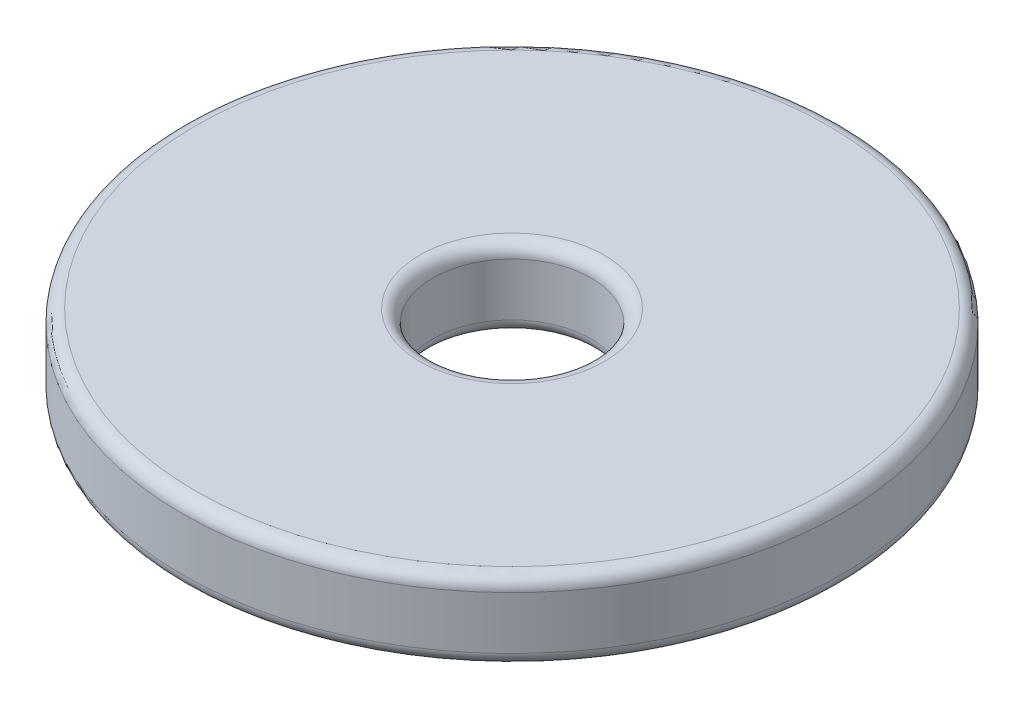
ISO-10303-21;
HEADER;
FILE_DESCRIPTION(('STEP AP214'),'2;1');
FILE_NAME('part.step','',(''),(''),'','','');
FILE_SCHEMA(('AUTOMOTIVE_DESIGN { 1 0 10303 214 1 1 1 1 }'));
ENDSEC;
DATA;
#1=APPLICATION_CONTEXT('core data for automotive mechanical design processes');
#2=APPLICATION_PROTOCOL_DEFINITION('international standard','automotive_design',2000,#1);
#3=PRODUCT_CONTEXT('',#1,'mechanical');
#4=PRODUCT('Part','Part','',(#3));
#5=PRODUCT_RELATED_PRODUCT_CATEGORY('part','',(#4));
#6=PRODUCT_DEFINITION_FORMATION('','',#4);
#7=PRODUCT_DEFINITION_CONTEXT('part definition',#1,'design');
#8=PRODUCT_DEFINITION('design','',#6,#7);
#9=PRODUCT_DEFINITION_SHAPE('','',#8);
#10=(LENGTH_UNIT() NAMED_UNIT(*) SI_UNIT(.MILLI.,.METRE.));
#11=(NAMED_UNIT(*) PLANE_ANGLE_UNIT() SI_UNIT($,.RADIAN.));
#12=(NAMED_UNIT(*) SI_UNIT($,.STERADIAN.) SOLID_ANGLE_UNIT());
#13=UNCERTAINTY_MEASURE_WITH_UNIT(LENGTH_MEASURE(1.E-05),#10,'distance_accuracy_value','');
#14=(GEOMETRIC_REPRESENTATION_CONTEXT(3) GLOBAL_UNCERTAINTY_ASSIGNED_CONTEXT((#13)) GLOBAL_UNIT_ASSIGNED_CONTEXT((#10,
#11,#12)) REPRESENTATION_CONTEXT('',''));
#15=CARTESIAN_POINT('',(0.,0.,0.));
#16=DIRECTION('',(0.,0.,1.));
#17=DIRECTION('',(1.,0.,0.));
#18=AXIS2_PLACEMENT_3D('',#15,#16,#17);
#19=CARTESIAN_POINT('',(0.,3.,0.));
#20=DIRECTION('',(0.,1.,0.));
#21=DIRECTION('',(0.,0.,1.));
#22=AXIS2_PLACEMENT_3D('',#19,#20,#21);
#23=PLANE('',#22);
#24=CARTESIAN_POINT('',(0.,3.,0.));
#25=DIRECTION('',(0.,1.,0.));
#26=DIRECTION('',(0.,0.,1.));
#27=AXIS2_PLACEMENT_3D('',#24,#25,#26);
#28=CIRCLE('',#27,12.);
#29=CARTESIAN_POINT('',(0.,3.,12.));
#30=VERTEX_POINT('',#29);
#31=EDGE_CURVE('E42',#30,#30,#28,.T.);
#32=ORIENTED_EDGE('',*,*,#31,.T.);
#33=EDGE_LOOP('',(#32));
#34=FACE_BOUND('',#33,.T.);
#35=CARTESIAN_POINT('',(0.,3.,0.));
#36=DIRECTION('',(0.,1.,0.));
#37=DIRECTION('',(0.,0.,1.));
#38=AXIS2_PLACEMENT_3D('',#35,#36,#37);
#39=CIRCLE('',#38,3.5);
#40=CARTESIAN_POINT('',(0.,3.,3.5));
#41=VERTEX_POINT('',#40);
#42=EDGE_CURVE('E46',#41,#41,#39,.F.);
#43=ORIENTED_EDGE('',*,*,#42,.T.);
#44=EDGE_LOOP('',(#43));
#45=FACE_BOUND('',#44,.T.);
#46=ADVANCED_FACE('F31',(#34,#45),#23,.T.);
#47=CARTESIAN_POINT('',(0.,0.,0.));
#48=DIRECTION('',(0.,1.,0.));
#49=DIRECTION('',(0.,0.,1.));
#50=AXIS2_PLACEMENT_3D('',#47,#48,#49);
#51=PLANE('',#50);
#52=CARTESIAN_POINT('',(0.,0.,0.));
#53=DIRECTION('',(0.,1.,0.));
#54=DIRECTION('',(0.,0.,1.));
#55=AXIS2_PLACEMENT_3D('',#52,#53,#54);
#56=CIRCLE('',#55,12.);
#57=CARTESIAN_POINT('',(0.,0.,12.));
#58=VERTEX_POINT('',#57);
#59=EDGE_CURVE('E51',#58,#58,#56,.F.);
#60=ORIENTED_EDGE('',*,*,#59,.T.);
#61=EDGE_LOOP('',(#60));
#62=FACE_BOUND('',#61,.T.);
#63=CARTESIAN_POINT('',(0.,0.,0.));
#64=DIRECTION('',(0.,1.,0.));
#65=DIRECTION('',(0.,0.,1.));
#66=AXIS2_PLACEMENT_3D('',#63,#64,#65);
#67=CIRCLE('',#66,3.5);
#68=CARTESIAN_POINT('',(0.,0.,3.5));
#69=VERTEX_POINT('',#68);
#70=EDGE_CURVE('E54',#69,#69,#67,.T.);
#71=ORIENTED_EDGE('',*,*,#70,.T.);
#72=EDGE_LOOP('',(#71));
#73=FACE_BOUND('',#72,.T.);
#74=ADVANCED_FACE('F76',(#62,#73),#51,.F.);
#75=CARTESIAN_POINT('',(0.,3.,0.));
#76=DIRECTION('',(0.,-1.,0.));
#77=DIRECTION('',(0.,0.,-1.));
#78=AXIS2_PLACEMENT_3D('',#75,#76,#77);
#79=CYLINDRICAL_SURFACE('',#78,12.5);
#80=CARTESIAN_POINT('',(0.,0.5,0.));
#81=DIRECTION('',(0.,1.,0.));
#82=DIRECTION('',(0.,0.,1.));
#83=AXIS2_PLACEMENT_3D('',#80,#81,#82);
#84=CIRCLE('',#83,12.5);
#85=CARTESIAN_POINT('',(0.,0.5,12.5));
#86=VERTEX_POINT('',#85);
#87=EDGE_CURVE('E57',#86,#86,#84,.T.);
#88=ORIENTED_EDGE('',*,*,#87,.T.);
#89=EDGE_LOOP('',(#88));
#90=FACE_BOUND('',#89,.T.);
#91=CARTESIAN_POINT('',(0.,2.5,0.));
#92=DIRECTION('',(0.,1.,0.));
#93=DIRECTION('',(0.,0.,1.));
#94=AXIS2_PLACEMENT_3D('',#91,#92,#93);
#95=CIRCLE('',#94,12.5);
#96=CARTESIAN_POINT('',(0.,2.5,12.5));
#97=VERTEX_POINT('',#96);
#98=EDGE_CURVE('E60',#97,#97,#95,.F.);
#99=ORIENTED_EDGE('',*,*,#98,.T.);
#100=EDGE_LOOP('',(#99));
#101=FACE_BOUND('',#100,.T.);
#102=ADVANCED_FACE('F64',(#90,#101),#79,.T.);
#103=CARTESIAN_POINT('',(0.,3.,0.));
#104=DIRECTION('',(0.,-1.,0.));
#105=DIRECTION('',(0.,0.,-1.));
#106=AXIS2_PLACEMENT_3D('',#103,#104,#105);
#107=CYLINDRICAL_SURFACE('',#106,3.);
#108=CARTESIAN_POINT('',(0.,0.5,0.));
#109=DIRECTION('',(0.,1.,0.));
#110=DIRECTION('',(0.,0.,1.));
#111=AXIS2_PLACEMENT_3D('',#108,#109,#110);
#112=CIRCLE('',#111,3.);
#113=CARTESIAN_POINT('',(0.,0.5,3.));
#114=VERTEX_POINT('',#113);
#115=EDGE_CURVE('E10',#114,#114,#112,.F.);
#116=ORIENTED_EDGE('',*,*,#115,.T.);
#117=EDGE_LOOP('',(#116));
#118=FACE_BOUND('',#117,.T.);
#119=CARTESIAN_POINT('',(0.,2.5,0.));
#120=DIRECTION('',(0.,1.,0.));
#121=DIRECTION('',(0.,0.,1.));
#122=AXIS2_PLACEMENT_3D('',#119,#120,#121);
#123=CIRCLE('',#122,3.);
#124=CARTESIAN_POINT('',(0.,2.5,3.));
#125=VERTEX_POINT('',#124);
#126=EDGE_CURVE('E38',#125,#125,#123,.T.);
#127=ORIENTED_EDGE('',*,*,#126,.T.);
#128=EDGE_LOOP('',(#127));
#129=FACE_BOUND('',#128,.T.);
#130=ADVANCED_FACE('F92',(#118,#129),#107,.F.);
#131=CARTESIAN_POINT('',(0.,0.5,0.));
#132=DIRECTION('',(0.,1.,0.));
#133=DIRECTION('',(0.,0.,1.));
#134=AXIS2_PLACEMENT_3D('',#131,#132,#133);
#135=TOROIDAL_SURFACE('',#134,12.,0.5);
#136=ORIENTED_EDGE('',*,*,#59,.F.);
#137=EDGE_LOOP('',(#136));
#138=FACE_BOUND('',#137,.T.);
#139=ORIENTED_EDGE('',*,*,#87,.F.);
#140=EDGE_LOOP('',(#139));
#141=FACE_BOUND('',#140,.T.);
#142=ADVANCED_FACE('F70',(#138,#141),#135,.T.);
#143=CARTESIAN_POINT('',(0.,2.5,0.));
#144=DIRECTION('',(0.,1.,0.));
#145=DIRECTION('',(0.,0.,1.));
#146=AXIS2_PLACEMENT_3D('',#143,#144,#145);
#147=TOROIDAL_SURFACE('',#146,12.,0.5);
#148=ORIENTED_EDGE('',*,*,#98,.F.);
#149=EDGE_LOOP('',(#148));
#150=FACE_BOUND('',#149,.T.);
#151=ORIENTED_EDGE('',*,*,#31,.F.);
#152=EDGE_LOOP('',(#151));
#153=FACE_BOUND('',#152,.T.);
#154=ADVANCED_FACE('F66',(#150,#153),#147,.T.);
#155=CARTESIAN_POINT('',(0.,0.5,0.));
#156=DIRECTION('',(0.,1.,0.));
#157=DIRECTION('',(0.,0.,1.));
#158=AXIS2_PLACEMENT_3D('',#155,#156,#157);
#159=TOROIDAL_SURFACE('',#158,3.5,0.5);
#160=ORIENTED_EDGE('',*,*,#115,.F.);
#161=EDGE_LOOP('',(#160));
#162=FACE_BOUND('',#161,.T.);
#163=ORIENTED_EDGE('',*,*,#70,.F.);
#164=EDGE_LOOP('',(#163));
#165=FACE_BOUND('',#164,.T.);
#166=ADVANCED_FACE('F69',(#162,#165),#159,.T.);
#167=CARTESIAN_POINT('',(0.,2.5,0.));
#168=DIRECTION('',(0.,1.,0.));
#169=DIRECTION('',(0.,0.,1.));
#170=AXIS2_PLACEMENT_3D('',#167,#168,#169);
#171=TOROIDAL_SURFACE('',#170,3.5,0.5);
#172=ORIENTED_EDGE('',*,*,#42,.F.);
#173=EDGE_LOOP('',(#172));
#174=FACE_BOUND('',#173,.T.);
#175=ORIENTED_EDGE('',*,*,#126,.F.);
#176=EDGE_LOOP('',(#175));
#177=FACE_BOUND('',#176,.T.);
#178=ADVANCED_FACE('F33',(#174,#177),#171,.T.);
#179=CLOSED_SHELL('',(#46,#74,#102,#130,#142,#154,#166,#178));
#180=MANIFOLD_SOLID_BREP('B2',#179);
#181=ADVANCED_BREP_SHAPE_REPRESENTATION('',(#18,#180),#14);
#182=SHAPE_DEFINITION_REPRESENTATION(#9,#181);
ENDSEC;
END-ISO-10303-21;
